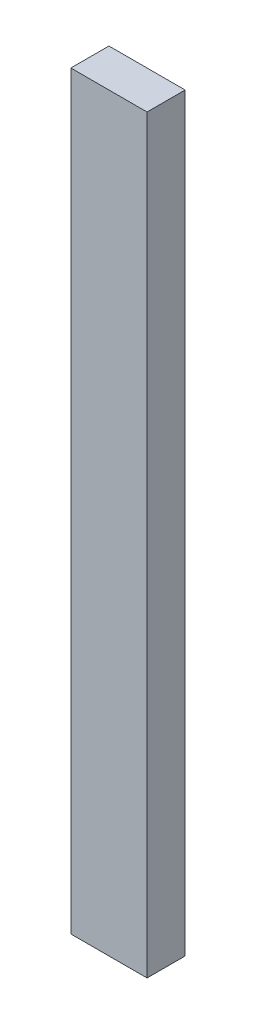
ISO-10303-21;
HEADER;
FILE_DESCRIPTION(('STEP AP214'),'2;1');
FILE_NAME('part.step','',(''),(''),'','','');
FILE_SCHEMA(('AUTOMOTIVE_DESIGN { 1 0 10303 214 1 1 1 1 }'));
ENDSEC;
DATA;
#1=APPLICATION_CONTEXT('core data for automotive mechanical design processes');
#2=APPLICATION_PROTOCOL_DEFINITION('international standard','automotive_design',2000,#1);
#3=PRODUCT_CONTEXT('',#1,'mechanical');
#4=PRODUCT('Part','Part','',(#3));
#5=PRODUCT_RELATED_PRODUCT_CATEGORY('part','',(#4));
#6=PRODUCT_DEFINITION_FORMATION('','',#4);
#7=PRODUCT_DEFINITION_CONTEXT('part definition',#1,'design');
#8=PRODUCT_DEFINITION('design','',#6,#7);
#9=PRODUCT_DEFINITION_SHAPE('','',#8);
#10=(LENGTH_UNIT() NAMED_UNIT(*) SI_UNIT(.MILLI.,.METRE.));
#11=(NAMED_UNIT(*) PLANE_ANGLE_UNIT() SI_UNIT($,.RADIAN.));
#12=(NAMED_UNIT(*) SI_UNIT($,.STERADIAN.) SOLID_ANGLE_UNIT());
#13=UNCERTAINTY_MEASURE_WITH_UNIT(LENGTH_MEASURE(1.E-05),#10,'distance_accuracy_value','');
#14=(GEOMETRIC_REPRESENTATION_CONTEXT(3) GLOBAL_UNCERTAINTY_ASSIGNED_CONTEXT((#13)) GLOBAL_UNIT_ASSIGNED_CONTEXT((#10,
#11,#12)) REPRESENTATION_CONTEXT('',''));
#15=CARTESIAN_POINT('',(0.,0.,0.));
#16=DIRECTION('',(0.,0.,1.));
#17=DIRECTION('',(1.,0.,0.));
#18=AXIS2_PLACEMENT_3D('',#15,#16,#17);
#19=CARTESIAN_POINT('',(25.4,250.,12.7));
#20=DIRECTION('',(-1.,0.,0.));
#21=DIRECTION('',(0.,0.,1.));
#22=AXIS2_PLACEMENT_3D('',#19,#20,#21);
#23=PLANE('',#22);
#24=DIRECTION('',(0.,0.,-1.));
#25=VECTOR('',#24,1.);
#26=CARTESIAN_POINT('',(25.4,-250.,12.7));
#27=LINE('',#26,#25);
#28=CARTESIAN_POINT('',(25.4,-250.,12.7));
#29=VERTEX_POINT('',#28);
#30=CARTESIAN_POINT('',(25.4,-250.,-12.7));
#31=VERTEX_POINT('',#30);
#32=EDGE_CURVE('E107',#29,#31,#27,.T.);
#33=ORIENTED_EDGE('',*,*,#32,.T.);
#34=DIRECTION('',(0.,-1.,0.));
#35=VECTOR('',#34,1.);
#36=CARTESIAN_POINT('',(25.4,250.,-12.7));
#37=LINE('',#36,#35);
#38=CARTESIAN_POINT('',(25.4,250.,-12.7));
#39=VERTEX_POINT('',#38);
#40=EDGE_CURVE('E11',#39,#31,#37,.T.);
#41=ORIENTED_EDGE('',*,*,#40,.F.);
#42=DIRECTION('',(0.,0.,-1.));
#43=VECTOR('',#42,1.);
#44=CARTESIAN_POINT('',(25.4,250.,12.7));
#45=LINE('',#44,#43);
#46=CARTESIAN_POINT('',(25.4,250.,12.7));
#47=VERTEX_POINT('',#46);
#48=EDGE_CURVE('E91',#47,#39,#45,.T.);
#49=ORIENTED_EDGE('',*,*,#48,.F.);
#50=DIRECTION('',(0.,-1.,0.));
#51=VECTOR('',#50,1.);
#52=CARTESIAN_POINT('',(25.4,250.,12.7));
#53=LINE('',#52,#51);
#54=EDGE_CURVE('E103',#47,#29,#53,.T.);
#55=ORIENTED_EDGE('',*,*,#54,.T.);
#56=EDGE_LOOP('',(#33,#41,#49,#55));
#57=FACE_BOUND('',#56,.T.);
#58=ADVANCED_FACE('F39',(#57),#23,.F.);
#59=CARTESIAN_POINT('',(-25.4,250.,-12.7));
#60=DIRECTION('',(0.,0.,1.));
#61=DIRECTION('',(1.,0.,0.));
#62=AXIS2_PLACEMENT_3D('',#59,#60,#61);
#63=PLANE('',#62);
#64=DIRECTION('',(-1.,0.,0.));
#65=VECTOR('',#64,1.);
#66=CARTESIAN_POINT('',(-25.4,-250.,-12.7));
#67=LINE('',#66,#65);
#68=CARTESIAN_POINT('',(-25.4,-250.,-12.7));
#69=VERTEX_POINT('',#68);
#70=EDGE_CURVE('E96',#31,#69,#67,.T.);
#71=ORIENTED_EDGE('',*,*,#70,.T.);
#72=DIRECTION('',(0.,-1.,0.));
#73=VECTOR('',#72,1.);
#74=CARTESIAN_POINT('',(-25.4,250.,-12.7));
#75=LINE('',#74,#73);
#76=CARTESIAN_POINT('',(-25.4,250.,-12.7));
#77=VERTEX_POINT('',#76);
#78=EDGE_CURVE('E48',#77,#69,#75,.T.);
#79=ORIENTED_EDGE('',*,*,#78,.F.);
#80=DIRECTION('',(-1.,0.,0.));
#81=VECTOR('',#80,1.);
#82=CARTESIAN_POINT('',(-25.4,250.,-12.7));
#83=LINE('',#82,#81);
#84=EDGE_CURVE('E86',#39,#77,#83,.T.);
#85=ORIENTED_EDGE('',*,*,#84,.F.);
#86=ORIENTED_EDGE('',*,*,#40,.T.);
#87=EDGE_LOOP('',(#71,#79,#85,#86));
#88=FACE_BOUND('',#87,.T.);
#89=ADVANCED_FACE('F95',(#88),#63,.F.);
#90=CARTESIAN_POINT('',(-25.4,250.,12.7));
#91=DIRECTION('',(1.,0.,0.));
#92=DIRECTION('',(0.,0.,-1.));
#93=AXIS2_PLACEMENT_3D('',#90,#91,#92);
#94=PLANE('',#93);
#95=DIRECTION('',(0.,0.,1.));
#96=VECTOR('',#95,1.);
#97=CARTESIAN_POINT('',(-25.4,-250.,12.7));
#98=LINE('',#97,#96);
#99=CARTESIAN_POINT('',(-25.4,-250.,12.7));
#100=VERTEX_POINT('',#99);
#101=EDGE_CURVE('E73',#69,#100,#98,.T.);
#102=ORIENTED_EDGE('',*,*,#101,.T.);
#103=DIRECTION('',(0.,-1.,0.));
#104=VECTOR('',#103,1.);
#105=CARTESIAN_POINT('',(-25.4,250.,12.7));
#106=LINE('',#105,#104);
#107=CARTESIAN_POINT('',(-25.4,250.,12.7));
#108=VERTEX_POINT('',#107);
#109=EDGE_CURVE('E98',#108,#100,#106,.T.);
#110=ORIENTED_EDGE('',*,*,#109,.F.);
#111=DIRECTION('',(0.,0.,1.));
#112=VECTOR('',#111,1.);
#113=CARTESIAN_POINT('',(-25.4,250.,12.7));
#114=LINE('',#113,#112);
#115=EDGE_CURVE('E89',#77,#108,#114,.T.);
#116=ORIENTED_EDGE('',*,*,#115,.F.);
#117=ORIENTED_EDGE('',*,*,#78,.T.);
#118=EDGE_LOOP('',(#102,#110,#116,#117));
#119=FACE_BOUND('',#118,.T.);
#120=ADVANCED_FACE('F99',(#119),#94,.F.);
#121=CARTESIAN_POINT('',(-25.4,250.,12.7));
#122=DIRECTION('',(0.,0.,-1.));
#123=DIRECTION('',(-1.,0.,0.));
#124=AXIS2_PLACEMENT_3D('',#121,#122,#123);
#125=PLANE('',#124);
#126=DIRECTION('',(1.,0.,0.));
#127=VECTOR('',#126,1.);
#128=CARTESIAN_POINT('',(-25.4,-250.,12.7));
#129=LINE('',#128,#127);
#130=EDGE_CURVE('E79',#100,#29,#129,.T.);
#131=ORIENTED_EDGE('',*,*,#130,.T.);
#132=ORIENTED_EDGE('',*,*,#54,.F.);
#133=DIRECTION('',(1.,0.,0.));
#134=VECTOR('',#133,1.);
#135=CARTESIAN_POINT('',(-25.4,250.,12.7));
#136=LINE('',#135,#134);
#137=EDGE_CURVE('E56',#108,#47,#136,.T.);
#138=ORIENTED_EDGE('',*,*,#137,.F.);
#139=ORIENTED_EDGE('',*,*,#109,.T.);
#140=EDGE_LOOP('',(#131,#132,#138,#139));
#141=FACE_BOUND('',#140,.T.);
#142=ADVANCED_FACE('F120',(#141),#125,.F.);
#143=CARTESIAN_POINT('',(0.,250.,0.));
#144=DIRECTION('',(0.,-1.,0.));
#145=DIRECTION('',(0.,0.,-1.));
#146=AXIS2_PLACEMENT_3D('',#143,#144,#145);
#147=PLANE('',#146);
#148=ORIENTED_EDGE('',*,*,#48,.T.);
#149=ORIENTED_EDGE('',*,*,#84,.T.);
#150=ORIENTED_EDGE('',*,*,#115,.T.);
#151=ORIENTED_EDGE('',*,*,#137,.T.);
#152=EDGE_LOOP('',(#148,#149,#150,#151));
#153=FACE_BOUND('',#152,.T.);
#154=ADVANCED_FACE('F87',(#153),#147,.F.);
#155=CARTESIAN_POINT('',(0.,-250.,0.));
#156=DIRECTION('',(0.,-1.,0.));
#157=DIRECTION('',(0.,0.,-1.));
#158=AXIS2_PLACEMENT_3D('',#155,#156,#157);
#159=PLANE('',#158);
#160=ORIENTED_EDGE('',*,*,#32,.F.);
#161=ORIENTED_EDGE('',*,*,#130,.F.);
#162=ORIENTED_EDGE('',*,*,#101,.F.);
#163=ORIENTED_EDGE('',*,*,#70,.F.);
#164=EDGE_LOOP('',(#160,#161,#162,#163));
#165=FACE_BOUND('',#164,.T.);
#166=ADVANCED_FACE('F123',(#165),#159,.T.);
#167=CLOSED_SHELL('',(#58,#89,#120,#142,#154,#166));
#168=MANIFOLD_SOLID_BREP('B2',#167);
#169=ADVANCED_BREP_SHAPE_REPRESENTATION('',(#18,#168),#14);
#170=SHAPE_DEFINITION_REPRESENTATION(#9,#169);
ENDSEC;
END-ISO-10303-21;
